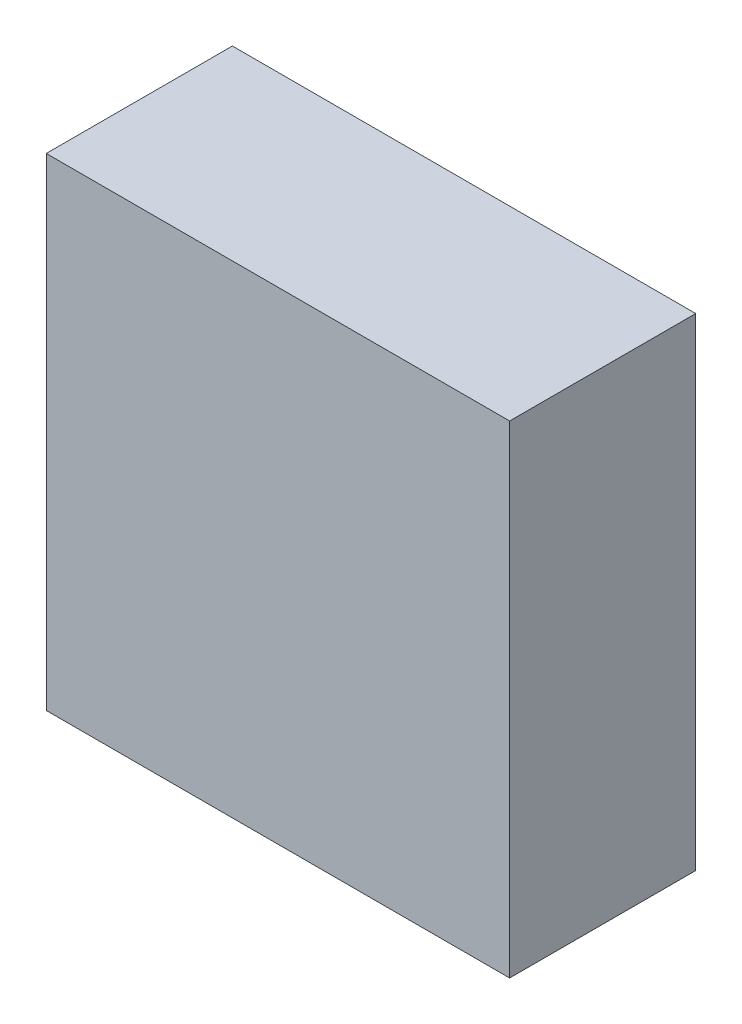
ISO-10303-21;
HEADER;
FILE_DESCRIPTION(('STEP AP214'),'2;1');
FILE_NAME('part.step','',(''),(''),'','','');
FILE_SCHEMA(('AUTOMOTIVE_DESIGN { 1 0 10303 214 1 1 1 1 }'));
ENDSEC;
DATA;
#1=APPLICATION_CONTEXT('core data for automotive mechanical design processes');
#2=APPLICATION_PROTOCOL_DEFINITION('international standard','automotive_design',2000,#1);
#3=PRODUCT_CONTEXT('',#1,'mechanical');
#4=PRODUCT('Part','Part','',(#3));
#5=PRODUCT_RELATED_PRODUCT_CATEGORY('part','',(#4));
#6=PRODUCT_DEFINITION_FORMATION('','',#4);
#7=PRODUCT_DEFINITION_CONTEXT('part definition',#1,'design');
#8=PRODUCT_DEFINITION('design','',#6,#7);
#9=PRODUCT_DEFINITION_SHAPE('','',#8);
#10=(LENGTH_UNIT() NAMED_UNIT(*) SI_UNIT(.MILLI.,.METRE.));
#11=(NAMED_UNIT(*) PLANE_ANGLE_UNIT() SI_UNIT($,.RADIAN.));
#12=(NAMED_UNIT(*) SI_UNIT($,.STERADIAN.) SOLID_ANGLE_UNIT());
#13=UNCERTAINTY_MEASURE_WITH_UNIT(LENGTH_MEASURE(1.E-05),#10,'distance_accuracy_value','');
#14=(GEOMETRIC_REPRESENTATION_CONTEXT(3) GLOBAL_UNCERTAINTY_ASSIGNED_CONTEXT((#13)) GLOBAL_UNIT_ASSIGNED_CONTEXT((#10,
#11,#12)) REPRESENTATION_CONTEXT('',''));
#15=CARTESIAN_POINT('',(0.,0.,0.));
#16=DIRECTION('',(0.,0.,1.));
#17=DIRECTION('',(1.,0.,0.));
#18=AXIS2_PLACEMENT_3D('',#15,#16,#17);
#19=CARTESIAN_POINT('',(0.,0.,0.));
#20=DIRECTION('',(1.,0.,0.));
#21=DIRECTION('',(0.,0.,1.));
#22=AXIS2_PLACEMENT_3D('',#19,#20,#21);
#23=PLANE('',#22);
#24=DIRECTION('',(0.,1.,0.));
#25=VECTOR('',#24,1.);
#26=CARTESIAN_POINT('',(0.,0.,1.225));
#27=LINE('',#26,#25);
#28=CARTESIAN_POINT('',(0.,0.,1.225));
#29=VERTEX_POINT('',#28);
#30=CARTESIAN_POINT('',(0.,3.1752,1.225));
#31=VERTEX_POINT('',#30);
#32=EDGE_CURVE('E11',#29,#31,#27,.T.);
#33=ORIENTED_EDGE('',*,*,#32,.T.);
#34=DIRECTION('',(0.,0.,1.));
#35=VECTOR('',#34,1.);
#36=CARTESIAN_POINT('',(0.,3.1752,0.));
#37=LINE('',#36,#35);
#38=CARTESIAN_POINT('',(0.,3.1752,0.));
#39=VERTEX_POINT('',#38);
#40=EDGE_CURVE('E23',#39,#31,#37,.T.);
#41=ORIENTED_EDGE('',*,*,#40,.F.);
#42=DIRECTION('',(0.,1.,0.));
#43=VECTOR('',#42,1.);
#44=CARTESIAN_POINT('',(0.,0.,0.));
#45=LINE('',#44,#43);
#46=CARTESIAN_POINT('',(0.,0.,0.));
#47=VERTEX_POINT('',#46);
#48=EDGE_CURVE('E85',#47,#39,#45,.T.);
#49=ORIENTED_EDGE('',*,*,#48,.F.);
#50=DIRECTION('',(0.,0.,1.));
#51=VECTOR('',#50,1.);
#52=CARTESIAN_POINT('',(0.,0.,0.));
#53=LINE('',#52,#51);
#54=EDGE_CURVE('E35',#47,#29,#53,.T.);
#55=ORIENTED_EDGE('',*,*,#54,.T.);
#56=EDGE_LOOP('',(#33,#41,#49,#55));
#57=FACE_BOUND('',#56,.T.);
#58=ADVANCED_FACE('F16',(#57),#23,.F.);
#59=CARTESIAN_POINT('',(3.05,0.,0.));
#60=DIRECTION('',(1.,0.,0.));
#61=DIRECTION('',(0.,0.,1.));
#62=AXIS2_PLACEMENT_3D('',#59,#60,#61);
#63=PLANE('',#62);
#64=DIRECTION('',(0.,0.,1.));
#65=VECTOR('',#64,1.);
#66=CARTESIAN_POINT('',(3.05,0.,0.));
#67=LINE('',#66,#65);
#68=CARTESIAN_POINT('',(3.05,0.,0.));
#69=VERTEX_POINT('',#68);
#70=CARTESIAN_POINT('',(3.05,0.,1.225));
#71=VERTEX_POINT('',#70);
#72=EDGE_CURVE('E82',#69,#71,#67,.T.);
#73=ORIENTED_EDGE('',*,*,#72,.F.);
#74=DIRECTION('',(0.,1.,0.));
#75=VECTOR('',#74,1.);
#76=CARTESIAN_POINT('',(3.05,0.,0.));
#77=LINE('',#76,#75);
#78=CARTESIAN_POINT('',(3.05,3.1752,0.));
#79=VERTEX_POINT('',#78);
#80=EDGE_CURVE('E62',#69,#79,#77,.T.);
#81=ORIENTED_EDGE('',*,*,#80,.T.);
#82=DIRECTION('',(0.,0.,1.));
#83=VECTOR('',#82,1.);
#84=CARTESIAN_POINT('',(3.05,3.1752,0.));
#85=LINE('',#84,#83);
#86=CARTESIAN_POINT('',(3.05,3.1752,1.225));
#87=VERTEX_POINT('',#86);
#88=EDGE_CURVE('E56',#79,#87,#85,.T.);
#89=ORIENTED_EDGE('',*,*,#88,.T.);
#90=DIRECTION('',(0.,1.,0.));
#91=VECTOR('',#90,1.);
#92=CARTESIAN_POINT('',(3.05,0.,1.225));
#93=LINE('',#92,#91);
#94=EDGE_CURVE('E59',#71,#87,#93,.T.);
#95=ORIENTED_EDGE('',*,*,#94,.F.);
#96=EDGE_LOOP('',(#73,#81,#89,#95));
#97=FACE_BOUND('',#96,.T.);
#98=ADVANCED_FACE('F58',(#97),#63,.T.);
#99=CARTESIAN_POINT('',(0.,0.,0.));
#100=DIRECTION('',(0.,1.,0.));
#101=DIRECTION('',(0.,0.,1.));
#102=AXIS2_PLACEMENT_3D('',#99,#100,#101);
#103=PLANE('',#102);
#104=ORIENTED_EDGE('',*,*,#72,.T.);
#105=DIRECTION('',(1.,0.,0.));
#106=VECTOR('',#105,1.);
#107=CARTESIAN_POINT('',(0.,0.,1.225));
#108=LINE('',#107,#106);
#109=EDGE_CURVE('E70',#29,#71,#108,.T.);
#110=ORIENTED_EDGE('',*,*,#109,.F.);
#111=ORIENTED_EDGE('',*,*,#54,.F.);
#112=DIRECTION('',(1.,0.,0.));
#113=VECTOR('',#112,1.);
#114=CARTESIAN_POINT('',(0.,0.,0.));
#115=LINE('',#114,#113);
#116=EDGE_CURVE('E75',#47,#69,#115,.T.);
#117=ORIENTED_EDGE('',*,*,#116,.T.);
#118=EDGE_LOOP('',(#104,#110,#111,#117));
#119=FACE_BOUND('',#118,.T.);
#120=ADVANCED_FACE('F90',(#119),#103,.F.);
#121=CARTESIAN_POINT('',(0.,3.1752,0.));
#122=DIRECTION('',(0.,1.,0.));
#123=DIRECTION('',(0.,0.,1.));
#124=AXIS2_PLACEMENT_3D('',#121,#122,#123);
#125=PLANE('',#124);
#126=DIRECTION('',(1.,0.,0.));
#127=VECTOR('',#126,1.);
#128=CARTESIAN_POINT('',(0.,3.1752,0.));
#129=LINE('',#128,#127);
#130=EDGE_CURVE('E73',#39,#79,#129,.T.);
#131=ORIENTED_EDGE('',*,*,#130,.F.);
#132=ORIENTED_EDGE('',*,*,#40,.T.);
#133=DIRECTION('',(1.,0.,0.));
#134=VECTOR('',#133,1.);
#135=CARTESIAN_POINT('',(0.,3.1752,1.225));
#136=LINE('',#135,#134);
#137=EDGE_CURVE('E68',#31,#87,#136,.T.);
#138=ORIENTED_EDGE('',*,*,#137,.T.);
#139=ORIENTED_EDGE('',*,*,#88,.F.);
#140=EDGE_LOOP('',(#131,#132,#138,#139));
#141=FACE_BOUND('',#140,.T.);
#142=ADVANCED_FACE('F72',(#141),#125,.T.);
#143=CARTESIAN_POINT('',(0.,0.,0.));
#144=DIRECTION('',(0.,0.,1.));
#145=DIRECTION('',(1.,0.,0.));
#146=AXIS2_PLACEMENT_3D('',#143,#144,#145);
#147=PLANE('',#146);
#148=ORIENTED_EDGE('',*,*,#130,.T.);
#149=ORIENTED_EDGE('',*,*,#80,.F.);
#150=ORIENTED_EDGE('',*,*,#116,.F.);
#151=ORIENTED_EDGE('',*,*,#48,.T.);
#152=EDGE_LOOP('',(#148,#149,#150,#151));
#153=FACE_BOUND('',#152,.T.);
#154=ADVANCED_FACE('F88',(#153),#147,.F.);
#155=CARTESIAN_POINT('',(0.,0.,1.225));
#156=DIRECTION('',(0.,0.,1.));
#157=DIRECTION('',(1.,0.,0.));
#158=AXIS2_PLACEMENT_3D('',#155,#156,#157);
#159=PLANE('',#158);
#160=ORIENTED_EDGE('',*,*,#32,.F.);
#161=ORIENTED_EDGE('',*,*,#109,.T.);
#162=ORIENTED_EDGE('',*,*,#94,.T.);
#163=ORIENTED_EDGE('',*,*,#137,.F.);
#164=EDGE_LOOP('',(#160,#161,#162,#163));
#165=FACE_BOUND('',#164,.T.);
#166=ADVANCED_FACE('F67',(#165),#159,.T.);
#167=CLOSED_SHELL('',(#58,#98,#120,#142,#154,#166));
#168=MANIFOLD_SOLID_BREP('B1',#167);
#169=ADVANCED_BREP_SHAPE_REPRESENTATION('',(#18,#168),#14);
#170=SHAPE_DEFINITION_REPRESENTATION(#9,#169);
ENDSEC;
END-ISO-10303-21;
